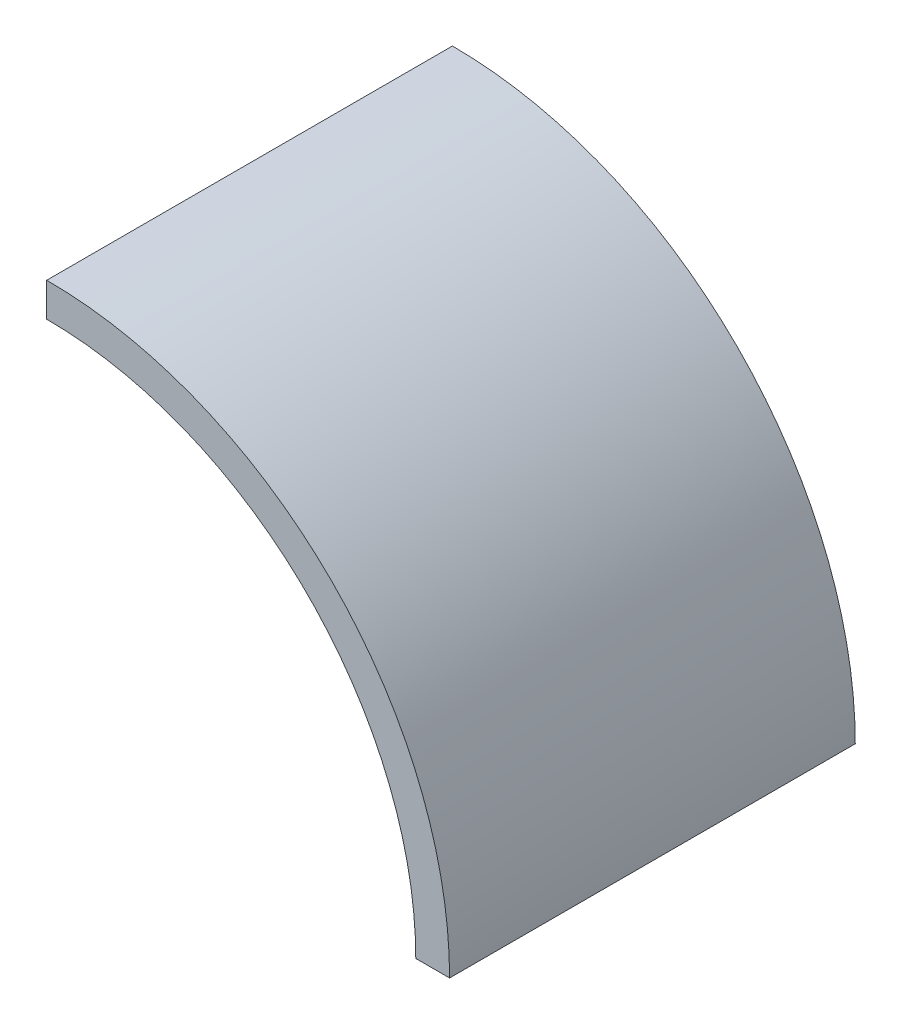
ISO-10303-21;
HEADER;
FILE_DESCRIPTION(('STEP AP214'),'2;1');
FILE_NAME('part.step','',(''),(''),'','','');
FILE_SCHEMA(('AUTOMOTIVE_DESIGN { 1 0 10303 214 1 1 1 1 }'));
ENDSEC;
DATA;
#1=APPLICATION_CONTEXT('core data for automotive mechanical design processes');
#2=APPLICATION_PROTOCOL_DEFINITION('international standard','automotive_design',2000,#1);
#3=PRODUCT_CONTEXT('',#1,'mechanical');
#4=PRODUCT('Part','Part','',(#3));
#5=PRODUCT_RELATED_PRODUCT_CATEGORY('part','',(#4));
#6=PRODUCT_DEFINITION_FORMATION('','',#4);
#7=PRODUCT_DEFINITION_CONTEXT('part definition',#1,'design');
#8=PRODUCT_DEFINITION('design','',#6,#7);
#9=PRODUCT_DEFINITION_SHAPE('','',#8);
#10=(LENGTH_UNIT() NAMED_UNIT(*) SI_UNIT(.MILLI.,.METRE.));
#11=(NAMED_UNIT(*) PLANE_ANGLE_UNIT() SI_UNIT($,.RADIAN.));
#12=(NAMED_UNIT(*) SI_UNIT($,.STERADIAN.) SOLID_ANGLE_UNIT());
#13=UNCERTAINTY_MEASURE_WITH_UNIT(LENGTH_MEASURE(1.E-05),#10,'distance_accuracy_value','');
#14=(GEOMETRIC_REPRESENTATION_CONTEXT(3) GLOBAL_UNCERTAINTY_ASSIGNED_CONTEXT((#13)) GLOBAL_UNIT_ASSIGNED_CONTEXT((#10,
#11,#12)) REPRESENTATION_CONTEXT('',''));
#15=CARTESIAN_POINT('',(0.,0.,0.));
#16=DIRECTION('',(0.,0.,1.));
#17=DIRECTION('',(1.,0.,0.));
#18=AXIS2_PLACEMENT_3D('',#15,#16,#17);
#19=CARTESIAN_POINT('',(0.,0.,18.));
#20=DIRECTION('',(0.,0.,-1.));
#21=DIRECTION('',(-1.,0.,0.));
#22=AXIS2_PLACEMENT_3D('',#19,#20,#21);
#23=CYLINDRICAL_SURFACE('',#22,17.875);
#24=CARTESIAN_POINT('',(0.,0.,0.));
#25=DIRECTION('',(0.,0.,1.));
#26=DIRECTION('',(1.,0.,0.));
#27=AXIS2_PLACEMENT_3D('',#24,#25,#26);
#28=CIRCLE('',#27,17.875);
#29=CARTESIAN_POINT('',(17.875,0.,0.));
#30=VERTEX_POINT('',#29);
#31=CARTESIAN_POINT('',(0.,17.875,0.));
#32=VERTEX_POINT('',#31);
#33=EDGE_CURVE('E107',#30,#32,#28,.T.);
#34=ORIENTED_EDGE('',*,*,#33,.T.);
#35=DIRECTION('',(0.,0.,-1.));
#36=VECTOR('',#35,1.);
#37=CARTESIAN_POINT('',(0.,17.875,18.));
#38=LINE('',#37,#36);
#39=CARTESIAN_POINT('',(0.,17.875,18.));
#40=VERTEX_POINT('',#39);
#41=EDGE_CURVE('E11',#40,#32,#38,.T.);
#42=ORIENTED_EDGE('',*,*,#41,.F.);
#43=CARTESIAN_POINT('',(0.,0.,18.));
#44=DIRECTION('',(0.,0.,1.));
#45=DIRECTION('',(1.,0.,0.));
#46=AXIS2_PLACEMENT_3D('',#43,#44,#45);
#47=CIRCLE('',#46,17.875);
#48=CARTESIAN_POINT('',(17.875,0.,18.));
#49=VERTEX_POINT('',#48);
#50=EDGE_CURVE('E91',#49,#40,#47,.T.);
#51=ORIENTED_EDGE('',*,*,#50,.F.);
#52=DIRECTION('',(0.,0.,-1.));
#53=VECTOR('',#52,1.);
#54=CARTESIAN_POINT('',(17.875,0.,18.));
#55=LINE('',#54,#53);
#56=EDGE_CURVE('E103',#49,#30,#55,.T.);
#57=ORIENTED_EDGE('',*,*,#56,.T.);
#58=EDGE_LOOP('',(#34,#42,#51,#57));
#59=FACE_BOUND('',#58,.T.);
#60=ADVANCED_FACE('F39',(#59),#23,.T.);
#61=CARTESIAN_POINT('',(0.,17.875,18.));
#62=DIRECTION('',(1.,0.,0.));
#63=DIRECTION('',(0.,0.,-1.));
#64=AXIS2_PLACEMENT_3D('',#61,#62,#63);
#65=PLANE('',#64);
#66=DIRECTION('',(0.,-1.,0.));
#67=VECTOR('',#66,1.);
#68=CARTESIAN_POINT('',(0.,17.875,0.));
#69=LINE('',#68,#67);
#70=CARTESIAN_POINT('',(0.,16.375,0.));
#71=VERTEX_POINT('',#70);
#72=EDGE_CURVE('E96',#32,#71,#69,.T.);
#73=ORIENTED_EDGE('',*,*,#72,.T.);
#74=DIRECTION('',(0.,0.,-1.));
#75=VECTOR('',#74,1.);
#76=CARTESIAN_POINT('',(0.,16.375,18.));
#77=LINE('',#76,#75);
#78=CARTESIAN_POINT('',(0.,16.375,18.));
#79=VERTEX_POINT('',#78);
#80=EDGE_CURVE('E48',#79,#71,#77,.T.);
#81=ORIENTED_EDGE('',*,*,#80,.F.);
#82=DIRECTION('',(0.,-1.,0.));
#83=VECTOR('',#82,1.);
#84=CARTESIAN_POINT('',(0.,17.875,18.));
#85=LINE('',#84,#83);
#86=EDGE_CURVE('E86',#40,#79,#85,.T.);
#87=ORIENTED_EDGE('',*,*,#86,.F.);
#88=ORIENTED_EDGE('',*,*,#41,.T.);
#89=EDGE_LOOP('',(#73,#81,#87,#88));
#90=FACE_BOUND('',#89,.T.);
#91=ADVANCED_FACE('F95',(#90),#65,.F.);
#92=CARTESIAN_POINT('',(0.,0.,18.));
#93=DIRECTION('',(0.,0.,-1.));
#94=DIRECTION('',(-1.,0.,0.));
#95=AXIS2_PLACEMENT_3D('',#92,#93,#94);
#96=CYLINDRICAL_SURFACE('',#95,16.375);
#97=CARTESIAN_POINT('',(0.,0.,0.));
#98=DIRECTION('',(0.,0.,-1.));
#99=DIRECTION('',(1.,0.,0.));
#100=AXIS2_PLACEMENT_3D('',#97,#98,#99);
#101=CIRCLE('',#100,16.375);
#102=CARTESIAN_POINT('',(16.375,0.,0.));
#103=VERTEX_POINT('',#102);
#104=EDGE_CURVE('E73',#71,#103,#101,.T.);
#105=ORIENTED_EDGE('',*,*,#104,.T.);
#106=DIRECTION('',(0.,0.,-1.));
#107=VECTOR('',#106,1.);
#108=CARTESIAN_POINT('',(16.375,0.,18.));
#109=LINE('',#108,#107);
#110=CARTESIAN_POINT('',(16.375,0.,18.));
#111=VERTEX_POINT('',#110);
#112=EDGE_CURVE('E98',#111,#103,#109,.T.);
#113=ORIENTED_EDGE('',*,*,#112,.F.);
#114=CARTESIAN_POINT('',(0.,0.,18.));
#115=DIRECTION('',(0.,0.,-1.));
#116=DIRECTION('',(1.,0.,0.));
#117=AXIS2_PLACEMENT_3D('',#114,#115,#116);
#118=CIRCLE('',#117,16.375);
#119=EDGE_CURVE('E89',#79,#111,#118,.T.);
#120=ORIENTED_EDGE('',*,*,#119,.F.);
#121=ORIENTED_EDGE('',*,*,#80,.T.);
#122=EDGE_LOOP('',(#105,#113,#120,#121));
#123=FACE_BOUND('',#122,.T.);
#124=ADVANCED_FACE('F99',(#123),#96,.F.);
#125=CARTESIAN_POINT('',(17.875,0.,18.));
#126=DIRECTION('',(0.,1.,0.));
#127=DIRECTION('',(-1.,0.,0.));
#128=AXIS2_PLACEMENT_3D('',#125,#126,#127);
#129=PLANE('',#128);
#130=DIRECTION('',(1.,0.,0.));
#131=VECTOR('',#130,1.);
#132=CARTESIAN_POINT('',(17.875,0.,0.));
#133=LINE('',#132,#131);
#134=EDGE_CURVE('E79',#103,#30,#133,.T.);
#135=ORIENTED_EDGE('',*,*,#134,.T.);
#136=ORIENTED_EDGE('',*,*,#56,.F.);
#137=DIRECTION('',(1.,0.,0.));
#138=VECTOR('',#137,1.);
#139=CARTESIAN_POINT('',(17.875,0.,18.));
#140=LINE('',#139,#138);
#141=EDGE_CURVE('E56',#111,#49,#140,.T.);
#142=ORIENTED_EDGE('',*,*,#141,.F.);
#143=ORIENTED_EDGE('',*,*,#112,.T.);
#144=EDGE_LOOP('',(#135,#136,#142,#143));
#145=FACE_BOUND('',#144,.T.);
#146=ADVANCED_FACE('F120',(#145),#129,.F.);
#147=CARTESIAN_POINT('',(0.,0.,18.));
#148=DIRECTION('',(0.,0.,1.));
#149=DIRECTION('',(1.,0.,0.));
#150=AXIS2_PLACEMENT_3D('',#147,#148,#149);
#151=PLANE('',#150);
#152=ORIENTED_EDGE('',*,*,#50,.T.);
#153=ORIENTED_EDGE('',*,*,#86,.T.);
#154=ORIENTED_EDGE('',*,*,#119,.T.);
#155=ORIENTED_EDGE('',*,*,#141,.T.);
#156=EDGE_LOOP('',(#152,#153,#154,#155));
#157=FACE_BOUND('',#156,.T.);
#158=ADVANCED_FACE('F87',(#157),#151,.T.);
#159=CARTESIAN_POINT('',(0.,0.,0.));
#160=DIRECTION('',(0.,0.,1.));
#161=DIRECTION('',(1.,0.,0.));
#162=AXIS2_PLACEMENT_3D('',#159,#160,#161);
#163=PLANE('',#162);
#164=ORIENTED_EDGE('',*,*,#33,.F.);
#165=ORIENTED_EDGE('',*,*,#134,.F.);
#166=ORIENTED_EDGE('',*,*,#104,.F.);
#167=ORIENTED_EDGE('',*,*,#72,.F.);
#168=EDGE_LOOP('',(#164,#165,#166,#167));
#169=FACE_BOUND('',#168,.T.);
#170=ADVANCED_FACE('F123',(#169),#163,.F.);
#171=CLOSED_SHELL('',(#60,#91,#124,#146,#158,#170));
#172=MANIFOLD_SOLID_BREP('B2',#171);
#173=ADVANCED_BREP_SHAPE_REPRESENTATION('',(#18,#172),#14);
#174=SHAPE_DEFINITION_REPRESENTATION(#9,#173);
ENDSEC;
END-ISO-10303-21;
